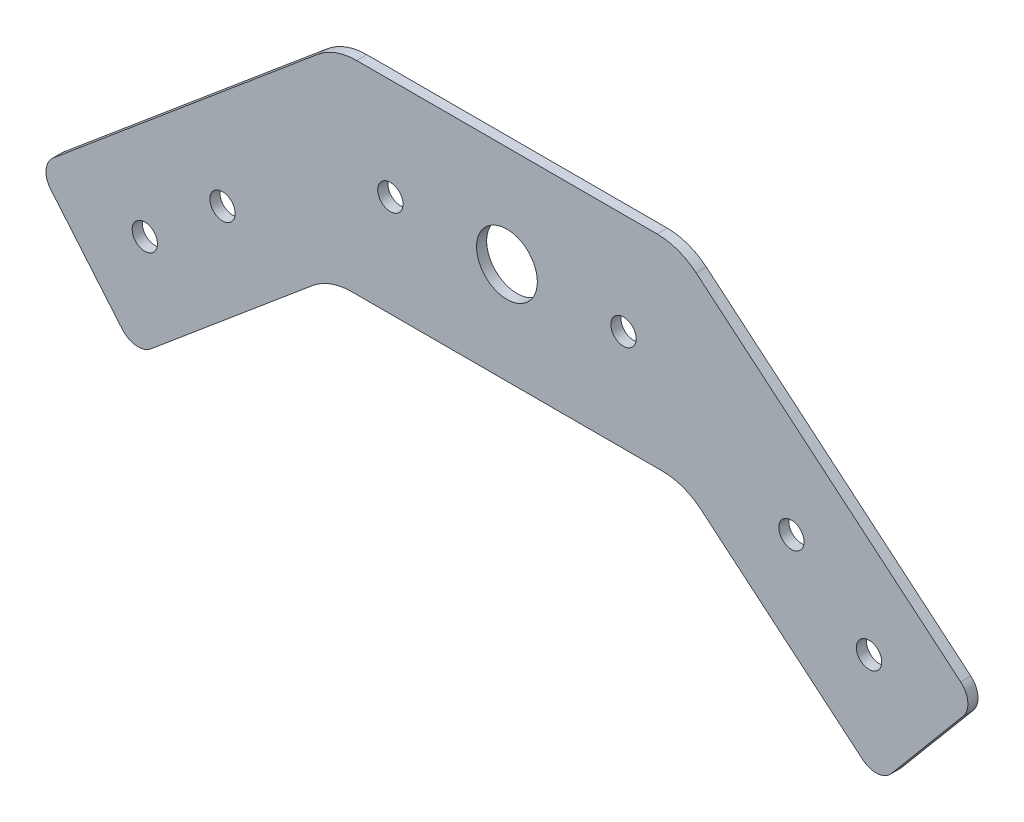
ISO-10303-21;
HEADER;
FILE_DESCRIPTION(('STEP AP214'),'2;1');
FILE_NAME('part.step','',(''),(''),'','','');
FILE_SCHEMA(('AUTOMOTIVE_DESIGN { 1 0 10303 214 1 1 1 1 }'));
ENDSEC;
DATA;
#1=APPLICATION_CONTEXT('core data for automotive mechanical design processes');
#2=APPLICATION_PROTOCOL_DEFINITION('international standard','automotive_design',2000,#1);
#3=PRODUCT_CONTEXT('',#1,'mechanical');
#4=PRODUCT('Part','Part','',(#3));
#5=PRODUCT_RELATED_PRODUCT_CATEGORY('part','',(#4));
#6=PRODUCT_DEFINITION_FORMATION('','',#4);
#7=PRODUCT_DEFINITION_CONTEXT('part definition',#1,'design');
#8=PRODUCT_DEFINITION('design','',#6,#7);
#9=PRODUCT_DEFINITION_SHAPE('','',#8);
#10=(LENGTH_UNIT() NAMED_UNIT(*) SI_UNIT(.MILLI.,.METRE.));
#11=(NAMED_UNIT(*) PLANE_ANGLE_UNIT() SI_UNIT($,.RADIAN.));
#12=(NAMED_UNIT(*) SI_UNIT($,.STERADIAN.) SOLID_ANGLE_UNIT());
#13=UNCERTAINTY_MEASURE_WITH_UNIT(LENGTH_MEASURE(1.E-05),#10,'distance_accuracy_value','');
#14=(GEOMETRIC_REPRESENTATION_CONTEXT(3) GLOBAL_UNCERTAINTY_ASSIGNED_CONTEXT((#13)) GLOBAL_UNIT_ASSIGNED_CONTEXT((#10,
#11,#12)) REPRESENTATION_CONTEXT('',''));
#15=CARTESIAN_POINT('',(0.,0.,0.));
#16=DIRECTION('',(0.,0.,1.));
#17=DIRECTION('',(1.,0.,0.));
#18=AXIS2_PLACEMENT_3D('',#15,#16,#17);
#19=CARTESIAN_POINT('',(-18.4144001216186,0.,-2.));
#20=DIRECTION('',(0.,-1.,0.));
#21=DIRECTION('',(1.,0.,0.));
#22=AXIS2_PLACEMENT_3D('',#19,#20,#21);
#23=PLANE('',#22);
#24=DIRECTION('',(1.,0.,0.));
#25=VECTOR('',#24,1.);
#26=CARTESIAN_POINT('',(-18.4144001216186,0.,0.));
#27=LINE('',#26,#25);
#28=CARTESIAN_POINT('',(-30.6323571888055,0.,0.));
#29=VERTEX_POINT('',#28);
#30=CARTESIAN_POINT('',(30.6323571888057,0.,0.));
#31=VERTEX_POINT('',#30);
#32=EDGE_CURVE('E226',#29,#31,#27,.T.);
#33=ORIENTED_EDGE('',*,*,#32,.F.);
#34=DIRECTION('',(0.,0.,1.));
#35=VECTOR('',#34,1.);
#36=CARTESIAN_POINT('',(-30.6323571888055,0.,-2.));
#37=LINE('',#36,#35);
#38=CARTESIAN_POINT('',(-30.6323571888055,0.,-2.));
#39=VERTEX_POINT('',#38);
#40=EDGE_CURVE('E11',#39,#29,#37,.T.);
#41=ORIENTED_EDGE('',*,*,#40,.F.);
#42=DIRECTION('',(1.,0.,0.));
#43=VECTOR('',#42,1.);
#44=CARTESIAN_POINT('',(-18.4144001216186,0.,-2.));
#45=LINE('',#44,#43);
#46=CARTESIAN_POINT('',(30.6323571888057,0.,-2.));
#47=VERTEX_POINT('',#46);
#48=EDGE_CURVE('E58',#39,#47,#45,.T.);
#49=ORIENTED_EDGE('',*,*,#48,.T.);
#50=DIRECTION('',(0.,0.,1.));
#51=VECTOR('',#50,1.);
#52=CARTESIAN_POINT('',(30.6323571888057,0.,-2.));
#53=LINE('',#52,#51);
#54=EDGE_CURVE('E43',#47,#31,#53,.T.);
#55=ORIENTED_EDGE('',*,*,#54,.T.);
#56=EDGE_LOOP('',(#33,#41,#49,#55));
#57=FACE_BOUND('',#56,.T.);
#58=ADVANCED_FACE('F39',(#57),#23,.T.);
#59=CARTESIAN_POINT('',(-30.6323571888055,-12.,-2.));
#60=DIRECTION('',(0.,0.,1.));
#61=DIRECTION('',(1.,0.,0.));
#62=AXIS2_PLACEMENT_3D('',#59,#60,#61);
#63=CYLINDRICAL_SURFACE('',#62,12.);
#64=CARTESIAN_POINT('',(-30.6323571888055,-12.,0.));
#65=DIRECTION('',(0.,0.,-1.));
#66=DIRECTION('',(1.,0.,0.));
#67=AXIS2_PLACEMENT_3D('',#64,#65,#66);
#68=CIRCLE('',#67,12.);
#69=CARTESIAN_POINT('',(-38.345808505044,-2.80746668257224,0.));
#70=VERTEX_POINT('',#69);
#71=EDGE_CURVE('E224',#70,#29,#68,.T.);
#72=ORIENTED_EDGE('',*,*,#71,.F.);
#73=DIRECTION('',(0.,0.,1.));
#74=VECTOR('',#73,1.);
#75=CARTESIAN_POINT('',(-38.345808505044,-2.80746668257224,-2.));
#76=LINE('',#75,#74);
#77=CARTESIAN_POINT('',(-38.345808505044,-2.80746668257224,-2.));
#78=VERTEX_POINT('',#77);
#79=EDGE_CURVE('E49',#78,#70,#76,.T.);
#80=ORIENTED_EDGE('',*,*,#79,.F.);
#81=CARTESIAN_POINT('',(-30.6323571888055,-12.,-2.));
#82=DIRECTION('',(0.,0.,-1.));
#83=DIRECTION('',(1.,0.,0.));
#84=AXIS2_PLACEMENT_3D('',#81,#82,#83);
#85=CIRCLE('',#84,12.);
#86=EDGE_CURVE('E174',#78,#39,#85,.T.);
#87=ORIENTED_EDGE('',*,*,#86,.T.);
#88=ORIENTED_EDGE('',*,*,#40,.T.);
#89=EDGE_LOOP('',(#72,#80,#87,#88));
#90=FACE_BOUND('',#89,.T.);
#91=ADVANCED_FACE('F258',(#90),#63,.F.);
#92=CARTESIAN_POINT('',(-38.345808505044,-2.80746668257224,-2.));
#93=DIRECTION('',(0.642787609686538,-0.766044443118979,0.));
#94=DIRECTION('',(0.766044443118979,0.642787609686538,0.));
#95=AXIS2_PLACEMENT_3D('',#92,#93,#94);
#96=PLANE('',#95);
#97=DIRECTION('',(0.766044443118979,0.642787609686538,0.));
#98=VECTOR('',#97,1.);
#99=CARTESIAN_POINT('',(-38.345808505044,-2.80746668257224,0.));
#100=LINE('',#99,#98);
#101=CARTESIAN_POINT('',(-70.238044383473,-29.5682300455807,0.));
#102=VERTEX_POINT('',#101);
#103=EDGE_CURVE('E162',#102,#70,#100,.T.);
#104=ORIENTED_EDGE('',*,*,#103,.F.);
#105=DIRECTION('',(0.,0.,1.));
#106=VECTOR('',#105,1.);
#107=CARTESIAN_POINT('',(-70.238044383473,-29.5682300455807,-2.));
#108=LINE('',#107,#106);
#109=CARTESIAN_POINT('',(-70.238044383473,-29.5682300455807,-2.));
#110=VERTEX_POINT('',#109);
#111=EDGE_CURVE('E157',#110,#102,#108,.T.);
#112=ORIENTED_EDGE('',*,*,#111,.F.);
#113=DIRECTION('',(0.766044443118979,0.642787609686538,0.));
#114=VECTOR('',#113,1.);
#115=CARTESIAN_POINT('',(-38.345808505044,-2.80746668257224,-2.));
#116=LINE('',#115,#114);
#117=EDGE_CURVE('E160',#110,#78,#116,.T.);
#118=ORIENTED_EDGE('',*,*,#117,.T.);
#119=ORIENTED_EDGE('',*,*,#79,.T.);
#120=EDGE_LOOP('',(#104,#112,#118,#119));
#121=FACE_BOUND('',#120,.T.);
#122=ADVANCED_FACE('F159',(#121),#96,.T.);
#123=CARTESIAN_POINT('',(-72.8091948222192,-26.5040522731048,-2.));
#124=DIRECTION('',(0.,0.,1.));
#125=DIRECTION('',(1.,0.,0.));
#126=AXIS2_PLACEMENT_3D('',#123,#124,#125);
#127=CYLINDRICAL_SURFACE('',#126,4.);
#128=CARTESIAN_POINT('',(-72.8091948222192,-26.5040522731048,0.));
#129=DIRECTION('',(0.,0.,1.));
#130=DIRECTION('',(-1.,0.,0.));
#131=AXIS2_PLACEMENT_3D('',#128,#129,#130);
#132=CIRCLE('',#131,4.);
#133=CARTESIAN_POINT('',(-75.8733725946951,-29.075202711851,0.));
#134=VERTEX_POINT('',#133);
#135=EDGE_CURVE('E221',#134,#102,#132,.T.);
#136=ORIENTED_EDGE('',*,*,#135,.F.);
#137=DIRECTION('',(0.,0.,1.));
#138=VECTOR('',#137,1.);
#139=CARTESIAN_POINT('',(-75.8733725946951,-29.075202711851,-2.));
#140=LINE('',#139,#138);
#141=CARTESIAN_POINT('',(-75.8733725946951,-29.075202711851,-2.));
#142=VERTEX_POINT('',#141);
#143=EDGE_CURVE('E167',#142,#134,#140,.T.);
#144=ORIENTED_EDGE('',*,*,#143,.F.);
#145=CARTESIAN_POINT('',(-72.8091948222192,-26.5040522731048,-2.));
#146=DIRECTION('',(0.,0.,1.));
#147=DIRECTION('',(-1.,0.,0.));
#148=AXIS2_PLACEMENT_3D('',#145,#146,#147);
#149=CIRCLE('',#148,4.);
#150=EDGE_CURVE('E172',#142,#110,#149,.T.);
#151=ORIENTED_EDGE('',*,*,#150,.T.);
#152=ORIENTED_EDGE('',*,*,#111,.T.);
#153=EDGE_LOOP('',(#136,#144,#151,#152));
#154=FACE_BOUND('',#153,.T.);
#155=ADVANCED_FACE('F176',(#154),#127,.T.);
#156=CARTESIAN_POINT('',(-75.8733725946951,-29.075202711851,-2.));
#157=DIRECTION('',(-0.766044443118979,-0.642787609686538,0.));
#158=DIRECTION('',(0.642787609686538,-0.766044443118979,0.));
#159=AXIS2_PLACEMENT_3D('',#156,#157,#158);
#160=PLANE('',#159);
#161=DIRECTION('',(0.642787609686538,-0.766044443118979,0.));
#162=VECTOR('',#161,1.);
#163=CARTESIAN_POINT('',(-75.8733725946951,-29.075202711851,0.));
#164=LINE('',#163,#162);
#165=CARTESIAN_POINT('',(-90.0147000077989,-12.2222249632334,0.));
#166=VERTEX_POINT('',#165);
#167=EDGE_CURVE('E218',#166,#134,#164,.T.);
#168=ORIENTED_EDGE('',*,*,#167,.F.);
#169=DIRECTION('',(0.,0.,1.));
#170=VECTOR('',#169,1.);
#171=CARTESIAN_POINT('',(-90.0147000077989,-12.2222249632334,-2.));
#172=LINE('',#171,#170);
#173=CARTESIAN_POINT('',(-90.0147000077989,-12.2222249632334,-2.));
#174=VERTEX_POINT('',#173);
#175=EDGE_CURVE('E230',#174,#166,#172,.T.);
#176=ORIENTED_EDGE('',*,*,#175,.F.);
#177=DIRECTION('',(0.642787609686538,-0.766044443118979,0.));
#178=VECTOR('',#177,1.);
#179=CARTESIAN_POINT('',(-75.8733725946951,-29.075202711851,-2.));
#180=LINE('',#179,#178);
#181=EDGE_CURVE('E177',#174,#142,#180,.T.);
#182=ORIENTED_EDGE('',*,*,#181,.T.);
#183=ORIENTED_EDGE('',*,*,#143,.T.);
#184=EDGE_LOOP('',(#168,#176,#182,#183));
#185=FACE_BOUND('',#184,.T.);
#186=ADVANCED_FACE('F271',(#185),#160,.T.);
#187=CARTESIAN_POINT('',(-86.950522235323,-9.65107452448727,-2.));
#188=DIRECTION('',(0.,0.,1.));
#189=DIRECTION('',(1.,0.,0.));
#190=AXIS2_PLACEMENT_3D('',#187,#188,#189);
#191=CYLINDRICAL_SURFACE('',#190,3.99999999999999);
#192=CARTESIAN_POINT('',(-86.950522235323,-9.65107452448727,0.));
#193=DIRECTION('',(0.,0.,1.));
#194=DIRECTION('',(1.,0.,0.));
#195=AXIS2_PLACEMENT_3D('',#192,#193,#194);
#196=CIRCLE('',#195,3.99999999999999);
#197=CARTESIAN_POINT('',(-89.5216726740692,-6.58689675201136,0.));
#198=VERTEX_POINT('',#197);
#199=EDGE_CURVE('E215',#198,#166,#196,.T.);
#200=ORIENTED_EDGE('',*,*,#199,.F.);
#201=DIRECTION('',(0.,0.,1.));
#202=VECTOR('',#201,1.);
#203=CARTESIAN_POINT('',(-89.5216726740692,-6.58689675201136,-2.));
#204=LINE('',#203,#202);
#205=CARTESIAN_POINT('',(-89.5216726740692,-6.58689675201136,-2.));
#206=VERTEX_POINT('',#205);
#207=EDGE_CURVE('E232',#206,#198,#204,.T.);
#208=ORIENTED_EDGE('',*,*,#207,.F.);
#209=CARTESIAN_POINT('',(-86.950522235323,-9.65107452448727,-2.));
#210=DIRECTION('',(0.,0.,1.));
#211=DIRECTION('',(1.,0.,0.));
#212=AXIS2_PLACEMENT_3D('',#209,#210,#211);
#213=CIRCLE('',#212,3.99999999999999);
#214=EDGE_CURVE('E179',#206,#174,#213,.T.);
#215=ORIENTED_EDGE('',*,*,#214,.T.);
#216=ORIENTED_EDGE('',*,*,#175,.T.);
#217=EDGE_LOOP('',(#200,#208,#215,#216));
#218=FACE_BOUND('',#217,.T.);
#219=ADVANCED_FACE('F274',(#218),#191,.T.);
#220=CARTESIAN_POINT('',(-89.5216726740692,-6.58689675201136,-2.));
#221=DIRECTION('',(-0.642787609686538,0.766044443118979,0.));
#222=DIRECTION('',(-0.766044443118979,-0.642787609686538,0.));
#223=AXIS2_PLACEMENT_3D('',#220,#221,#222);
#224=PLANE('',#223);
#225=DIRECTION('',(-0.766044443118979,-0.642787609686538,0.));
#226=VECTOR('',#225,1.);
#227=CARTESIAN_POINT('',(-89.5216726740692,-6.58689675201136,0.));
#228=LINE('',#227,#226);
#229=CARTESIAN_POINT('',(-37.3473796070879,37.1925333174278,0.));
#230=VERTEX_POINT('',#229);
#231=EDGE_CURVE('E212',#230,#198,#228,.T.);
#232=ORIENTED_EDGE('',*,*,#231,.F.);
#233=DIRECTION('',(0.,0.,1.));
#234=VECTOR('',#233,1.);
#235=CARTESIAN_POINT('',(-37.3473796070879,37.1925333174278,-2.));
#236=LINE('',#235,#234);
#237=CARTESIAN_POINT('',(-37.3473796070879,37.1925333174278,-2.));
#238=VERTEX_POINT('',#237);
#239=EDGE_CURVE('E234',#238,#230,#236,.T.);
#240=ORIENTED_EDGE('',*,*,#239,.F.);
#241=DIRECTION('',(-0.766044443118979,-0.642787609686538,0.));
#242=VECTOR('',#241,1.);
#243=CARTESIAN_POINT('',(-89.5216726740692,-6.58689675201136,-2.));
#244=LINE('',#243,#242);
#245=EDGE_CURVE('E345',#238,#206,#244,.T.);
#246=ORIENTED_EDGE('',*,*,#245,.T.);
#247=ORIENTED_EDGE('',*,*,#207,.T.);
#248=EDGE_LOOP('',(#232,#240,#246,#247));
#249=FACE_BOUND('',#248,.T.);
#250=ADVANCED_FACE('F278',(#249),#224,.T.);
#251=CARTESIAN_POINT('',(-29.6339282908495,28.,-2.));
#252=DIRECTION('',(0.,0.,1.));
#253=DIRECTION('',(1.,0.,0.));
#254=AXIS2_PLACEMENT_3D('',#251,#252,#253);
#255=CYLINDRICAL_SURFACE('',#254,12.);
#256=CARTESIAN_POINT('',(-29.6339282908495,28.,0.));
#257=DIRECTION('',(0.,0.,1.));
#258=DIRECTION('',(-1.,0.,0.));
#259=AXIS2_PLACEMENT_3D('',#256,#257,#258);
#260=CIRCLE('',#259,12.);
#261=CARTESIAN_POINT('',(-29.6339282908495,40.,0.));
#262=VERTEX_POINT('',#261);
#263=EDGE_CURVE('E209',#262,#230,#260,.T.);
#264=ORIENTED_EDGE('',*,*,#263,.F.);
#265=DIRECTION('',(0.,0.,1.));
#266=VECTOR('',#265,1.);
#267=CARTESIAN_POINT('',(-29.6339282908495,40.,-2.));
#268=LINE('',#267,#266);
#269=CARTESIAN_POINT('',(-29.6339282908495,40.,-2.));
#270=VERTEX_POINT('',#269);
#271=EDGE_CURVE('E236',#270,#262,#268,.T.);
#272=ORIENTED_EDGE('',*,*,#271,.F.);
#273=CARTESIAN_POINT('',(-29.6339282908495,28.,-2.));
#274=DIRECTION('',(0.,0.,1.));
#275=DIRECTION('',(-1.,0.,0.));
#276=AXIS2_PLACEMENT_3D('',#273,#274,#275);
#277=CIRCLE('',#276,12.);
#278=EDGE_CURVE('E343',#270,#238,#277,.T.);
#279=ORIENTED_EDGE('',*,*,#278,.T.);
#280=ORIENTED_EDGE('',*,*,#239,.T.);
#281=EDGE_LOOP('',(#264,#272,#279,#280));
#282=FACE_BOUND('',#281,.T.);
#283=ADVANCED_FACE('F282',(#282),#255,.T.);
#284=CARTESIAN_POINT('',(-29.6339282908495,40.,-2.));
#285=DIRECTION('',(0.,1.,0.));
#286=DIRECTION('',(-1.,0.,0.));
#287=AXIS2_PLACEMENT_3D('',#284,#285,#286);
#288=PLANE('',#287);
#289=DIRECTION('',(-1.,0.,0.));
#290=VECTOR('',#289,1.);
#291=CARTESIAN_POINT('',(-29.6339282908495,40.,0.));
#292=LINE('',#291,#290);
#293=CARTESIAN_POINT('',(29.6339282908495,40.,0.));
#294=VERTEX_POINT('',#293);
#295=EDGE_CURVE('E206',#294,#262,#292,.T.);
#296=ORIENTED_EDGE('',*,*,#295,.F.);
#297=DIRECTION('',(0.,0.,1.));
#298=VECTOR('',#297,1.);
#299=CARTESIAN_POINT('',(29.6339282908495,40.,-2.));
#300=LINE('',#299,#298);
#301=CARTESIAN_POINT('',(29.6339282908495,40.,-2.));
#302=VERTEX_POINT('',#301);
#303=EDGE_CURVE('E238',#302,#294,#300,.T.);
#304=ORIENTED_EDGE('',*,*,#303,.F.);
#305=DIRECTION('',(-1.,0.,0.));
#306=VECTOR('',#305,1.);
#307=CARTESIAN_POINT('',(29.6339282908495,40.,-2.));
#308=LINE('',#307,#306);
#309=EDGE_CURVE('E338',#302,#270,#308,.T.);
#310=ORIENTED_EDGE('',*,*,#309,.T.);
#311=ORIENTED_EDGE('',*,*,#271,.T.);
#312=EDGE_LOOP('',(#296,#304,#310,#311));
#313=FACE_BOUND('',#312,.T.);
#314=ADVANCED_FACE('F286',(#313),#288,.T.);
#315=CARTESIAN_POINT('',(29.6339282908495,28.,-2.));
#316=DIRECTION('',(0.,0.,1.));
#317=DIRECTION('',(1.,0.,0.));
#318=AXIS2_PLACEMENT_3D('',#315,#316,#317);
#319=CYLINDRICAL_SURFACE('',#318,12.);
#320=CARTESIAN_POINT('',(29.6339282908495,28.,0.));
#321=DIRECTION('',(0.,0.,1.));
#322=DIRECTION('',(1.,0.,0.));
#323=AXIS2_PLACEMENT_3D('',#320,#321,#322);
#324=CIRCLE('',#323,12.);
#325=CARTESIAN_POINT('',(37.3473796070879,37.1925333174278,0.));
#326=VERTEX_POINT('',#325);
#327=EDGE_CURVE('E203',#326,#294,#324,.T.);
#328=ORIENTED_EDGE('',*,*,#327,.F.);
#329=DIRECTION('',(0.,0.,1.));
#330=VECTOR('',#329,1.);
#331=CARTESIAN_POINT('',(37.3473796070879,37.1925333174278,-2.));
#332=LINE('',#331,#330);
#333=CARTESIAN_POINT('',(37.3473796070879,37.1925333174278,-2.));
#334=VERTEX_POINT('',#333);
#335=EDGE_CURVE('E241',#334,#326,#332,.T.);
#336=ORIENTED_EDGE('',*,*,#335,.F.);
#337=CARTESIAN_POINT('',(29.6339282908495,28.,-2.));
#338=DIRECTION('',(0.,0.,1.));
#339=DIRECTION('',(1.,0.,0.));
#340=AXIS2_PLACEMENT_3D('',#337,#338,#339);
#341=CIRCLE('',#340,12.);
#342=EDGE_CURVE('E336',#334,#302,#341,.T.);
#343=ORIENTED_EDGE('',*,*,#342,.T.);
#344=ORIENTED_EDGE('',*,*,#303,.T.);
#345=EDGE_LOOP('',(#328,#336,#343,#344));
#346=FACE_BOUND('',#345,.T.);
#347=ADVANCED_FACE('F290',(#346),#319,.T.);
#348=CARTESIAN_POINT('',(89.5216726740692,-6.58689675201139,-2.));
#349=DIRECTION('',(0.642787609686538,0.766044443118979,0.));
#350=DIRECTION('',(-0.766044443118979,0.642787609686538,0.));
#351=AXIS2_PLACEMENT_3D('',#348,#349,#350);
#352=PLANE('',#351);
#353=DIRECTION('',(-0.766044443118979,0.642787609686538,0.));
#354=VECTOR('',#353,1.);
#355=CARTESIAN_POINT('',(89.5216726740692,-6.58689675201139,0.));
#356=LINE('',#355,#354);
#357=CARTESIAN_POINT('',(89.5216726740692,-6.58689675201138,0.));
#358=VERTEX_POINT('',#357);
#359=EDGE_CURVE('E200',#358,#326,#356,.T.);
#360=ORIENTED_EDGE('',*,*,#359,.F.);
#361=DIRECTION('',(0.,0.,1.));
#362=VECTOR('',#361,1.);
#363=CARTESIAN_POINT('',(89.5216726740692,-6.58689675201138,-2.));
#364=LINE('',#363,#362);
#365=CARTESIAN_POINT('',(89.5216726740692,-6.58689675201138,-2.));
#366=VERTEX_POINT('',#365);
#367=EDGE_CURVE('E243',#366,#358,#364,.T.);
#368=ORIENTED_EDGE('',*,*,#367,.F.);
#369=DIRECTION('',(-0.766044443118979,0.642787609686538,0.));
#370=VECTOR('',#369,1.);
#371=CARTESIAN_POINT('',(89.5216726740692,-6.58689675201139,-2.));
#372=LINE('',#371,#370);
#373=EDGE_CURVE('E347',#366,#334,#372,.T.);
#374=ORIENTED_EDGE('',*,*,#373,.T.);
#375=ORIENTED_EDGE('',*,*,#335,.T.);
#376=EDGE_LOOP('',(#360,#368,#374,#375));
#377=FACE_BOUND('',#376,.T.);
#378=ADVANCED_FACE('F294',(#377),#352,.T.);
#379=CARTESIAN_POINT('',(86.950522235323,-9.65107452448731,-2.));
#380=DIRECTION('',(0.,0.,1.));
#381=DIRECTION('',(1.,0.,0.));
#382=AXIS2_PLACEMENT_3D('',#379,#380,#381);
#383=CYLINDRICAL_SURFACE('',#382,4.00000000000001);
#384=CARTESIAN_POINT('',(86.950522235323,-9.65107452448731,0.));
#385=DIRECTION('',(0.,0.,1.));
#386=DIRECTION('',(-1.,0.,0.));
#387=AXIS2_PLACEMENT_3D('',#384,#385,#386);
#388=CIRCLE('',#387,4.00000000000001);
#389=CARTESIAN_POINT('',(90.014700007799,-12.2222249632335,0.));
#390=VERTEX_POINT('',#389);
#391=EDGE_CURVE('E197',#390,#358,#388,.T.);
#392=ORIENTED_EDGE('',*,*,#391,.F.);
#393=DIRECTION('',(0.,0.,1.));
#394=VECTOR('',#393,1.);
#395=CARTESIAN_POINT('',(90.014700007799,-12.2222249632335,-2.));
#396=LINE('',#395,#394);
#397=CARTESIAN_POINT('',(90.014700007799,-12.2222249632335,-2.));
#398=VERTEX_POINT('',#397);
#399=EDGE_CURVE('E245',#398,#390,#396,.T.);
#400=ORIENTED_EDGE('',*,*,#399,.F.);
#401=CARTESIAN_POINT('',(86.950522235323,-9.65107452448731,-2.));
#402=DIRECTION('',(0.,0.,1.));
#403=DIRECTION('',(-1.,0.,0.));
#404=AXIS2_PLACEMENT_3D('',#401,#402,#403);
#405=CIRCLE('',#404,4.00000000000001);
#406=EDGE_CURVE('E330',#398,#366,#405,.T.);
#407=ORIENTED_EDGE('',*,*,#406,.T.);
#408=ORIENTED_EDGE('',*,*,#367,.T.);
#409=EDGE_LOOP('',(#392,#400,#407,#408));
#410=FACE_BOUND('',#409,.T.);
#411=ADVANCED_FACE('F298',(#410),#383,.T.);
#412=CARTESIAN_POINT('',(90.014700007799,-12.2222249632335,-2.));
#413=DIRECTION('',(0.766044443118979,-0.642787609686538,0.));
#414=DIRECTION('',(0.642787609686538,0.766044443118979,0.));
#415=AXIS2_PLACEMENT_3D('',#412,#413,#414);
#416=PLANE('',#415);
#417=DIRECTION('',(0.642787609686538,0.766044443118979,0.));
#418=VECTOR('',#417,1.);
#419=CARTESIAN_POINT('',(90.014700007799,-12.2222249632335,0.));
#420=LINE('',#419,#418);
#421=CARTESIAN_POINT('',(75.8733725946952,-29.0752027118509,0.));
#422=VERTEX_POINT('',#421);
#423=EDGE_CURVE('E194',#422,#390,#420,.T.);
#424=ORIENTED_EDGE('',*,*,#423,.F.);
#425=DIRECTION('',(0.,0.,1.));
#426=VECTOR('',#425,1.);
#427=CARTESIAN_POINT('',(75.8733725946952,-29.0752027118509,-2.));
#428=LINE('',#427,#426);
#429=CARTESIAN_POINT('',(75.8733725946952,-29.0752027118509,-2.));
#430=VERTEX_POINT('',#429);
#431=EDGE_CURVE('E247',#430,#422,#428,.T.);
#432=ORIENTED_EDGE('',*,*,#431,.F.);
#433=DIRECTION('',(0.642787609686538,0.766044443118979,0.));
#434=VECTOR('',#433,1.);
#435=CARTESIAN_POINT('',(90.014700007799,-12.2222249632335,-2.));
#436=LINE('',#435,#434);
#437=EDGE_CURVE('E326',#430,#398,#436,.T.);
#438=ORIENTED_EDGE('',*,*,#437,.T.);
#439=ORIENTED_EDGE('',*,*,#399,.T.);
#440=EDGE_LOOP('',(#424,#432,#438,#439));
#441=FACE_BOUND('',#440,.T.);
#442=ADVANCED_FACE('F302',(#441),#416,.T.);
#443=CARTESIAN_POINT('',(72.8091948222193,-26.5040522731048,-2.));
#444=DIRECTION('',(0.,0.,1.));
#445=DIRECTION('',(1.,0.,0.));
#446=AXIS2_PLACEMENT_3D('',#443,#444,#445);
#447=CYLINDRICAL_SURFACE('',#446,4.);
#448=CARTESIAN_POINT('',(72.8091948222193,-26.5040522731048,0.));
#449=DIRECTION('',(0.,0.,1.));
#450=DIRECTION('',(-1.,0.,0.));
#451=AXIS2_PLACEMENT_3D('',#448,#449,#450);
#452=CIRCLE('',#451,4.);
#453=CARTESIAN_POINT('',(70.2380443834731,-29.5682300455807,0.));
#454=VERTEX_POINT('',#453);
#455=EDGE_CURVE('E191',#454,#422,#452,.T.);
#456=ORIENTED_EDGE('',*,*,#455,.F.);
#457=DIRECTION('',(0.,0.,1.));
#458=VECTOR('',#457,1.);
#459=CARTESIAN_POINT('',(70.2380443834731,-29.5682300455807,-2.));
#460=LINE('',#459,#458);
#461=CARTESIAN_POINT('',(70.2380443834731,-29.5682300455807,-2.));
#462=VERTEX_POINT('',#461);
#463=EDGE_CURVE('E249',#462,#454,#460,.T.);
#464=ORIENTED_EDGE('',*,*,#463,.F.);
#465=CARTESIAN_POINT('',(72.8091948222193,-26.5040522731048,-2.));
#466=DIRECTION('',(0.,0.,1.));
#467=DIRECTION('',(-1.,0.,0.));
#468=AXIS2_PLACEMENT_3D('',#465,#466,#467);
#469=CIRCLE('',#468,4.);
#470=EDGE_CURVE('E361',#462,#430,#469,.T.);
#471=ORIENTED_EDGE('',*,*,#470,.T.);
#472=ORIENTED_EDGE('',*,*,#431,.T.);
#473=EDGE_LOOP('',(#456,#464,#471,#472));
#474=FACE_BOUND('',#473,.T.);
#475=ADVANCED_FACE('F306',(#474),#447,.T.);
#476=CARTESIAN_POINT('',(70.2380443834731,-29.5682300455807,-2.));
#477=DIRECTION('',(-0.642787609686537,-0.76604444311898,0.));
#478=DIRECTION('',(0.76604444311898,-0.642787609686537,0.));
#479=AXIS2_PLACEMENT_3D('',#476,#477,#478);
#480=PLANE('',#479);
#481=DIRECTION('',(0.76604444311898,-0.642787609686537,0.));
#482=VECTOR('',#481,1.);
#483=CARTESIAN_POINT('',(70.2380443834731,-29.5682300455807,0.));
#484=LINE('',#483,#482);
#485=CARTESIAN_POINT('',(38.3458085050441,-2.80746668257222,0.));
#486=VERTEX_POINT('',#485);
#487=EDGE_CURVE('E187',#486,#454,#484,.T.);
#488=ORIENTED_EDGE('',*,*,#487,.F.);
#489=DIRECTION('',(0.,0.,1.));
#490=VECTOR('',#489,1.);
#491=CARTESIAN_POINT('',(38.3458085050441,-2.80746668257222,-2.));
#492=LINE('',#491,#490);
#493=CARTESIAN_POINT('',(38.3458085050441,-2.80746668257222,-2.));
#494=VERTEX_POINT('',#493);
#495=EDGE_CURVE('E250',#494,#486,#492,.T.);
#496=ORIENTED_EDGE('',*,*,#495,.F.);
#497=DIRECTION('',(0.76604444311898,-0.642787609686537,0.));
#498=VECTOR('',#497,1.);
#499=CARTESIAN_POINT('',(70.2380443834731,-29.5682300455807,-2.));
#500=LINE('',#499,#498);
#501=EDGE_CURVE('E319',#494,#462,#500,.T.);
#502=ORIENTED_EDGE('',*,*,#501,.T.);
#503=ORIENTED_EDGE('',*,*,#463,.T.);
#504=EDGE_LOOP('',(#488,#496,#502,#503));
#505=FACE_BOUND('',#504,.T.);
#506=ADVANCED_FACE('F309',(#505),#480,.T.);
#507=CARTESIAN_POINT('',(30.6323571888057,-12.,-2.));
#508=DIRECTION('',(0.,0.,1.));
#509=DIRECTION('',(1.,0.,0.));
#510=AXIS2_PLACEMENT_3D('',#507,#508,#509);
#511=CYLINDRICAL_SURFACE('',#510,12.);
#512=CARTESIAN_POINT('',(30.6323571888057,-12.,0.));
#513=DIRECTION('',(0.,0.,-1.));
#514=DIRECTION('',(1.,0.,0.));
#515=AXIS2_PLACEMENT_3D('',#512,#513,#514);
#516=CIRCLE('',#515,12.);
#517=EDGE_CURVE('E184',#31,#486,#516,.T.);
#518=ORIENTED_EDGE('',*,*,#517,.F.);
#519=ORIENTED_EDGE('',*,*,#54,.F.);
#520=CARTESIAN_POINT('',(30.6323571888057,-12.,-2.));
#521=DIRECTION('',(0.,0.,-1.));
#522=DIRECTION('',(1.,0.,0.));
#523=AXIS2_PLACEMENT_3D('',#520,#521,#522);
#524=CIRCLE('',#523,12.);
#525=EDGE_CURVE('E364',#47,#494,#524,.T.);
#526=ORIENTED_EDGE('',*,*,#525,.T.);
#527=ORIENTED_EDGE('',*,*,#495,.T.);
#528=EDGE_LOOP('',(#518,#519,#526,#527));
#529=FACE_BOUND('',#528,.T.);
#530=ADVANCED_FACE('F41',(#529),#511,.F.);
#531=CARTESIAN_POINT('',(30.6323571888057,-12.,-2.));
#532=DIRECTION('',(0.,0.,1.));
#533=DIRECTION('',(1.,0.,0.));
#534=AXIS2_PLACEMENT_3D('',#531,#532,#533);
#535=PLANE('',#534);
#536=CARTESIAN_POINT('',(23.,20.,-2.));
#537=DIRECTION('',(0.,0.,1.));
#538=DIRECTION('',(-1.,0.,0.));
#539=AXIS2_PLACEMENT_3D('',#536,#537,#538);
#540=CIRCLE('',#539,2.5);
#541=CARTESIAN_POINT('',(20.5,20.,-2.));
#542=VERTEX_POINT('',#541);
#543=EDGE_CURVE('E400',#542,#542,#540,.T.);
#544=ORIENTED_EDGE('',*,*,#543,.T.);
#545=EDGE_LOOP('',(#544));
#546=FACE_BOUND('',#545,.T.);
#547=CARTESIAN_POINT('',(-23.,20.,-2.));
#548=DIRECTION('',(0.,0.,1.));
#549=DIRECTION('',(1.,0.,0.));
#550=AXIS2_PLACEMENT_3D('',#547,#548,#549);
#551=CIRCLE('',#550,2.5);
#552=CARTESIAN_POINT('',(-20.5,20.,-2.));
#553=VERTEX_POINT('',#552);
#554=EDGE_CURVE('E394',#553,#553,#551,.T.);
#555=ORIENTED_EDGE('',*,*,#554,.T.);
#556=EDGE_LOOP('',(#555));
#557=FACE_BOUND('',#556,.T.);
#558=CARTESIAN_POINT('',(0.,20.,-2.));
#559=DIRECTION('',(0.,0.,1.));
#560=DIRECTION('',(1.,0.,0.));
#561=AXIS2_PLACEMENT_3D('',#558,#559,#560);
#562=CIRCLE('',#561,6.);
#563=CARTESIAN_POINT('',(6.,20.,-2.));
#564=VERTEX_POINT('',#563);
#565=EDGE_CURVE('E388',#564,#564,#562,.T.);
#566=ORIENTED_EDGE('',*,*,#565,.T.);
#567=EDGE_LOOP('',(#566));
#568=FACE_BOUND('',#567,.T.);
#569=CARTESIAN_POINT('',(71.4533696544623,-11.0068996922441,-2.));
#570=DIRECTION('',(0.,0.,1.));
#571=DIRECTION('',(-1.,0.,0.));
#572=AXIS2_PLACEMENT_3D('',#569,#570,#571);
#573=CIRCLE('',#572,2.5);
#574=CARTESIAN_POINT('',(68.9533696544623,-11.0068996922441,-2.));
#575=VERTEX_POINT('',#574);
#576=EDGE_CURVE('E382',#575,#575,#573,.T.);
#577=ORIENTED_EDGE('',*,*,#576,.T.);
#578=EDGE_LOOP('',(#577));
#579=FACE_BOUND('',#578,.T.);
#580=CARTESIAN_POINT('',(56.1324807920827,1.84885250148664,-2.));
#581=DIRECTION('',(0.,0.,1.));
#582=DIRECTION('',(-1.,0.,0.));
#583=AXIS2_PLACEMENT_3D('',#580,#581,#582);
#584=CIRCLE('',#583,2.49999999999999);
#585=CARTESIAN_POINT('',(53.6324807920827,1.84885250148664,-2.));
#586=VERTEX_POINT('',#585);
#587=EDGE_CURVE('E376',#586,#586,#584,.T.);
#588=ORIENTED_EDGE('',*,*,#587,.T.);
#589=EDGE_LOOP('',(#588));
#590=FACE_BOUND('',#589,.T.);
#591=CARTESIAN_POINT('',(-56.1324807920827,1.84885250148664,-2.));
#592=DIRECTION('',(0.,0.,1.));
#593=DIRECTION('',(1.,0.,0.));
#594=AXIS2_PLACEMENT_3D('',#591,#592,#593);
#595=CIRCLE('',#594,2.49999999999999);
#596=CARTESIAN_POINT('',(-53.6324807920827,1.84885250148664,-2.));
#597=VERTEX_POINT('',#596);
#598=EDGE_CURVE('E370',#597,#597,#595,.T.);
#599=ORIENTED_EDGE('',*,*,#598,.T.);
#600=EDGE_LOOP('',(#599));
#601=FACE_BOUND('',#600,.T.);
#602=CARTESIAN_POINT('',(-71.4533696544623,-11.0068996922441,-2.));
#603=DIRECTION('',(0.,0.,1.));
#604=DIRECTION('',(1.,0.,0.));
#605=AXIS2_PLACEMENT_3D('',#602,#603,#604);
#606=CIRCLE('',#605,2.5);
#607=CARTESIAN_POINT('',(-68.9533696544623,-11.0068996922441,-2.));
#608=VERTEX_POINT('',#607);
#609=EDGE_CURVE('E188',#608,#608,#606,.T.);
#610=ORIENTED_EDGE('',*,*,#609,.T.);
#611=EDGE_LOOP('',(#610));
#612=FACE_BOUND('',#611,.T.);
#613=ORIENTED_EDGE('',*,*,#48,.F.);
#614=ORIENTED_EDGE('',*,*,#86,.F.);
#615=ORIENTED_EDGE('',*,*,#117,.F.);
#616=ORIENTED_EDGE('',*,*,#150,.F.);
#617=ORIENTED_EDGE('',*,*,#181,.F.);
#618=ORIENTED_EDGE('',*,*,#214,.F.);
#619=ORIENTED_EDGE('',*,*,#245,.F.);
#620=ORIENTED_EDGE('',*,*,#278,.F.);
#621=ORIENTED_EDGE('',*,*,#309,.F.);
#622=ORIENTED_EDGE('',*,*,#342,.F.);
#623=ORIENTED_EDGE('',*,*,#373,.F.);
#624=ORIENTED_EDGE('',*,*,#406,.F.);
#625=ORIENTED_EDGE('',*,*,#437,.F.);
#626=ORIENTED_EDGE('',*,*,#470,.F.);
#627=ORIENTED_EDGE('',*,*,#501,.F.);
#628=ORIENTED_EDGE('',*,*,#525,.F.);
#629=EDGE_LOOP('',(#613,#614,#615,#616,#617,#618,#619,#620,#621,#622,#623,#624,#625,#626,#627,#628));
#630=FACE_BOUND('',#629,.T.);
#631=ADVANCED_FACE('F170',(#546,#557,#568,#579,#590,#601,#612,#630),#535,.F.);
#632=CARTESIAN_POINT('',(30.6323571888057,-12.,0.));
#633=DIRECTION('',(0.,0.,1.));
#634=DIRECTION('',(1.,0.,0.));
#635=AXIS2_PLACEMENT_3D('',#632,#633,#634);
#636=PLANE('',#635);
#637=CARTESIAN_POINT('',(23.,20.,0.));
#638=DIRECTION('',(0.,0.,1.));
#639=DIRECTION('',(-1.,0.,0.));
#640=AXIS2_PLACEMENT_3D('',#637,#638,#639);
#641=CIRCLE('',#640,2.5);
#642=CARTESIAN_POINT('',(20.5,20.,0.));
#643=VERTEX_POINT('',#642);
#644=EDGE_CURVE('E403',#643,#643,#641,.T.);
#645=ORIENTED_EDGE('',*,*,#644,.F.);
#646=EDGE_LOOP('',(#645));
#647=FACE_BOUND('',#646,.T.);
#648=CARTESIAN_POINT('',(-23.,20.,0.));
#649=DIRECTION('',(0.,0.,1.));
#650=DIRECTION('',(1.,0.,0.));
#651=AXIS2_PLACEMENT_3D('',#648,#649,#650);
#652=CIRCLE('',#651,2.5);
#653=CARTESIAN_POINT('',(-20.5,20.,0.));
#654=VERTEX_POINT('',#653);
#655=EDGE_CURVE('E397',#654,#654,#652,.T.);
#656=ORIENTED_EDGE('',*,*,#655,.F.);
#657=EDGE_LOOP('',(#656));
#658=FACE_BOUND('',#657,.T.);
#659=CARTESIAN_POINT('',(0.,20.,0.));
#660=DIRECTION('',(0.,0.,1.));
#661=DIRECTION('',(1.,0.,0.));
#662=AXIS2_PLACEMENT_3D('',#659,#660,#661);
#663=CIRCLE('',#662,6.);
#664=CARTESIAN_POINT('',(6.,20.,0.));
#665=VERTEX_POINT('',#664);
#666=EDGE_CURVE('E391',#665,#665,#663,.T.);
#667=ORIENTED_EDGE('',*,*,#666,.F.);
#668=EDGE_LOOP('',(#667));
#669=FACE_BOUND('',#668,.T.);
#670=CARTESIAN_POINT('',(71.4533696544623,-11.0068996922441,0.));
#671=DIRECTION('',(0.,0.,1.));
#672=DIRECTION('',(-1.,0.,0.));
#673=AXIS2_PLACEMENT_3D('',#670,#671,#672);
#674=CIRCLE('',#673,2.5);
#675=CARTESIAN_POINT('',(68.9533696544623,-11.0068996922441,0.));
#676=VERTEX_POINT('',#675);
#677=EDGE_CURVE('E385',#676,#676,#674,.T.);
#678=ORIENTED_EDGE('',*,*,#677,.F.);
#679=EDGE_LOOP('',(#678));
#680=FACE_BOUND('',#679,.T.);
#681=CARTESIAN_POINT('',(56.1324807920827,1.84885250148664,0.));
#682=DIRECTION('',(0.,0.,1.));
#683=DIRECTION('',(-1.,0.,0.));
#684=AXIS2_PLACEMENT_3D('',#681,#682,#683);
#685=CIRCLE('',#684,2.49999999999999);
#686=CARTESIAN_POINT('',(53.6324807920827,1.84885250148664,0.));
#687=VERTEX_POINT('',#686);
#688=EDGE_CURVE('E379',#687,#687,#685,.T.);
#689=ORIENTED_EDGE('',*,*,#688,.F.);
#690=EDGE_LOOP('',(#689));
#691=FACE_BOUND('',#690,.T.);
#692=CARTESIAN_POINT('',(-56.1324807920827,1.84885250148664,0.));
#693=DIRECTION('',(0.,0.,1.));
#694=DIRECTION('',(1.,0.,0.));
#695=AXIS2_PLACEMENT_3D('',#692,#693,#694);
#696=CIRCLE('',#695,2.49999999999999);
#697=CARTESIAN_POINT('',(-53.6324807920827,1.84885250148664,0.));
#698=VERTEX_POINT('',#697);
#699=EDGE_CURVE('E373',#698,#698,#696,.T.);
#700=ORIENTED_EDGE('',*,*,#699,.F.);
#701=EDGE_LOOP('',(#700));
#702=FACE_BOUND('',#701,.T.);
#703=CARTESIAN_POINT('',(-71.4533696544623,-11.0068996922441,0.));
#704=DIRECTION('',(0.,0.,1.));
#705=DIRECTION('',(1.,0.,0.));
#706=AXIS2_PLACEMENT_3D('',#703,#704,#705);
#707=CIRCLE('',#706,2.5);
#708=CARTESIAN_POINT('',(-68.9533696544623,-11.0068996922441,0.));
#709=VERTEX_POINT('',#708);
#710=EDGE_CURVE('E367',#709,#709,#707,.T.);
#711=ORIENTED_EDGE('',*,*,#710,.F.);
#712=EDGE_LOOP('',(#711));
#713=FACE_BOUND('',#712,.T.);
#714=ORIENTED_EDGE('',*,*,#32,.T.);
#715=ORIENTED_EDGE('',*,*,#517,.T.);
#716=ORIENTED_EDGE('',*,*,#487,.T.);
#717=ORIENTED_EDGE('',*,*,#455,.T.);
#718=ORIENTED_EDGE('',*,*,#423,.T.);
#719=ORIENTED_EDGE('',*,*,#391,.T.);
#720=ORIENTED_EDGE('',*,*,#359,.T.);
#721=ORIENTED_EDGE('',*,*,#327,.T.);
#722=ORIENTED_EDGE('',*,*,#295,.T.);
#723=ORIENTED_EDGE('',*,*,#263,.T.);
#724=ORIENTED_EDGE('',*,*,#231,.T.);
#725=ORIENTED_EDGE('',*,*,#199,.T.);
#726=ORIENTED_EDGE('',*,*,#167,.T.);
#727=ORIENTED_EDGE('',*,*,#135,.T.);
#728=ORIENTED_EDGE('',*,*,#103,.T.);
#729=ORIENTED_EDGE('',*,*,#71,.T.);
#730=EDGE_LOOP('',(#714,#715,#716,#717,#718,#719,#720,#721,#722,#723,#724,#725,#726,#727,#728,#729));
#731=FACE_BOUND('',#730,.T.);
#732=ADVANCED_FACE('F257',(#647,#658,#669,#680,#691,#702,#713,#731),#636,.T.);
#733=CARTESIAN_POINT('',(-71.4533696544623,-11.0068996922441,-2.));
#734=DIRECTION('',(0.,0.,1.));
#735=DIRECTION('',(1.,0.,0.));
#736=AXIS2_PLACEMENT_3D('',#733,#734,#735);
#737=CYLINDRICAL_SURFACE('',#736,2.5);
#738=ORIENTED_EDGE('',*,*,#609,.F.);
#739=EDGE_LOOP('',(#738));
#740=FACE_BOUND('',#739,.T.);
#741=ORIENTED_EDGE('',*,*,#710,.T.);
#742=EDGE_LOOP('',(#741));
#743=FACE_BOUND('',#742,.T.);
#744=ADVANCED_FACE('F420',(#740,#743),#737,.F.);
#745=CARTESIAN_POINT('',(-56.1324807920827,1.84885250148664,-2.));
#746=DIRECTION('',(0.,0.,1.));
#747=DIRECTION('',(1.,0.,0.));
#748=AXIS2_PLACEMENT_3D('',#745,#746,#747);
#749=CYLINDRICAL_SURFACE('',#748,2.49999999999999);
#750=ORIENTED_EDGE('',*,*,#598,.F.);
#751=EDGE_LOOP('',(#750));
#752=FACE_BOUND('',#751,.T.);
#753=ORIENTED_EDGE('',*,*,#699,.T.);
#754=EDGE_LOOP('',(#753));
#755=FACE_BOUND('',#754,.T.);
#756=ADVANCED_FACE('F434',(#752,#755),#749,.F.);
#757=CARTESIAN_POINT('',(56.1324807920827,1.84885250148664,-2.));
#758=DIRECTION('',(0.,0.,1.));
#759=DIRECTION('',(1.,0.,0.));
#760=AXIS2_PLACEMENT_3D('',#757,#758,#759);
#761=CYLINDRICAL_SURFACE('',#760,2.49999999999999);
#762=ORIENTED_EDGE('',*,*,#587,.F.);
#763=EDGE_LOOP('',(#762));
#764=FACE_BOUND('',#763,.T.);
#765=ORIENTED_EDGE('',*,*,#688,.T.);
#766=EDGE_LOOP('',(#765));
#767=FACE_BOUND('',#766,.T.);
#768=ADVANCED_FACE('F440',(#764,#767),#761,.F.);
#769=CARTESIAN_POINT('',(71.4533696544623,-11.0068996922441,-2.));
#770=DIRECTION('',(0.,0.,1.));
#771=DIRECTION('',(1.,0.,0.));
#772=AXIS2_PLACEMENT_3D('',#769,#770,#771);
#773=CYLINDRICAL_SURFACE('',#772,2.5);
#774=ORIENTED_EDGE('',*,*,#576,.F.);
#775=EDGE_LOOP('',(#774));
#776=FACE_BOUND('',#775,.T.);
#777=ORIENTED_EDGE('',*,*,#677,.T.);
#778=EDGE_LOOP('',(#777));
#779=FACE_BOUND('',#778,.T.);
#780=ADVANCED_FACE('F477',(#776,#779),#773,.F.);
#781=CARTESIAN_POINT('',(0.,20.,-2.));
#782=DIRECTION('',(0.,0.,1.));
#783=DIRECTION('',(1.,0.,0.));
#784=AXIS2_PLACEMENT_3D('',#781,#782,#783);
#785=CYLINDRICAL_SURFACE('',#784,6.);
#786=ORIENTED_EDGE('',*,*,#565,.F.);
#787=EDGE_LOOP('',(#786));
#788=FACE_BOUND('',#787,.T.);
#789=ORIENTED_EDGE('',*,*,#666,.T.);
#790=EDGE_LOOP('',(#789));
#791=FACE_BOUND('',#790,.T.);
#792=ADVANCED_FACE('F487',(#788,#791),#785,.F.);
#793=CARTESIAN_POINT('',(-23.,20.,-2.));
#794=DIRECTION('',(0.,0.,1.));
#795=DIRECTION('',(1.,0.,0.));
#796=AXIS2_PLACEMENT_3D('',#793,#794,#795);
#797=CYLINDRICAL_SURFACE('',#796,2.5);
#798=ORIENTED_EDGE('',*,*,#554,.F.);
#799=EDGE_LOOP('',(#798));
#800=FACE_BOUND('',#799,.T.);
#801=ORIENTED_EDGE('',*,*,#655,.T.);
#802=EDGE_LOOP('',(#801));
#803=FACE_BOUND('',#802,.T.);
#804=ADVANCED_FACE('F414',(#800,#803),#797,.F.);
#805=CARTESIAN_POINT('',(23.,20.,-2.));
#806=DIRECTION('',(0.,0.,1.));
#807=DIRECTION('',(1.,0.,0.));
#808=AXIS2_PLACEMENT_3D('',#805,#806,#807);
#809=CYLINDRICAL_SURFACE('',#808,2.5);
#810=ORIENTED_EDGE('',*,*,#543,.F.);
#811=EDGE_LOOP('',(#810));
#812=FACE_BOUND('',#811,.T.);
#813=ORIENTED_EDGE('',*,*,#644,.T.);
#814=EDGE_LOOP('',(#813));
#815=FACE_BOUND('',#814,.T.);
#816=ADVANCED_FACE('F411',(#812,#815),#809,.F.);
#817=CLOSED_SHELL('',(#58,#91,#122,#155,#186,#219,#250,#283,#314,#347,#378,#411,#442,#475,#506,
#530,#631,#732,#744,#756,#768,#780,#792,#804,#816));
#818=MANIFOLD_SOLID_BREP('B2',#817);
#819=ADVANCED_BREP_SHAPE_REPRESENTATION('',(#18,#818),#14);
#820=SHAPE_DEFINITION_REPRESENTATION(#9,#819);
ENDSEC;
END-ISO-10303-21;
